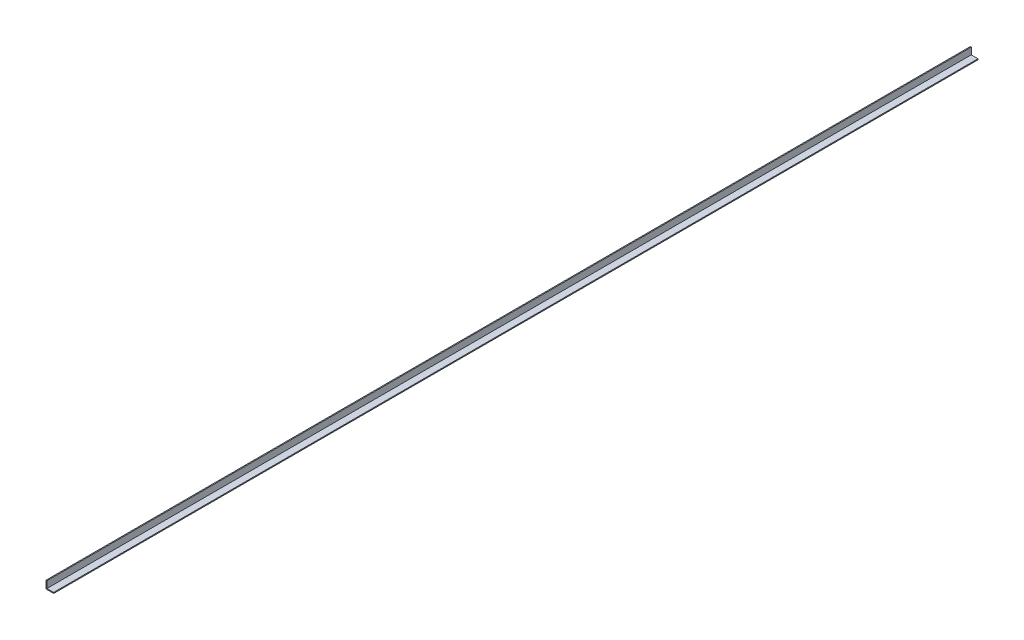
ISO-10303-21;
HEADER;
FILE_DESCRIPTION(('STEP AP214'),'2;1');
FILE_NAME('part.step','',(''),(''),'','','');
FILE_SCHEMA(('AUTOMOTIVE_DESIGN { 1 0 10303 214 1 1 1 1 }'));
ENDSEC;
DATA;
#1=APPLICATION_CONTEXT('core data for automotive mechanical design processes');
#2=APPLICATION_PROTOCOL_DEFINITION('international standard','automotive_design',2000,#1);
#3=PRODUCT_CONTEXT('',#1,'mechanical');
#4=PRODUCT('Part','Part','',(#3));
#5=PRODUCT_RELATED_PRODUCT_CATEGORY('part','',(#4));
#6=PRODUCT_DEFINITION_FORMATION('','',#4);
#7=PRODUCT_DEFINITION_CONTEXT('part definition',#1,'design');
#8=PRODUCT_DEFINITION('design','',#6,#7);
#9=PRODUCT_DEFINITION_SHAPE('','',#8);
#10=(LENGTH_UNIT() NAMED_UNIT(*) SI_UNIT(.MILLI.,.METRE.));
#11=(NAMED_UNIT(*) PLANE_ANGLE_UNIT() SI_UNIT($,.RADIAN.));
#12=(NAMED_UNIT(*) SI_UNIT($,.STERADIAN.) SOLID_ANGLE_UNIT());
#13=UNCERTAINTY_MEASURE_WITH_UNIT(LENGTH_MEASURE(1.E-05),#10,'distance_accuracy_value','');
#14=(GEOMETRIC_REPRESENTATION_CONTEXT(3) GLOBAL_UNCERTAINTY_ASSIGNED_CONTEXT((#13)) GLOBAL_UNIT_ASSIGNED_CONTEXT((#10,
#11,#12)) REPRESENTATION_CONTEXT('',''));
#15=CARTESIAN_POINT('',(0.,0.,0.));
#16=DIRECTION('',(0.,0.,1.));
#17=DIRECTION('',(1.,0.,0.));
#18=AXIS2_PLACEMENT_3D('',#15,#16,#17);
#19=CARTESIAN_POINT('',(6.35,50.8,-6100.));
#20=DIRECTION('',(0.,1.,0.));
#21=DIRECTION('',(0.,0.,1.));
#22=AXIS2_PLACEMENT_3D('',#19,#20,#21);
#23=PLANE('',#22);
#24=DIRECTION('',(-1.,0.,0.));
#25=VECTOR('',#24,1.);
#26=CARTESIAN_POINT('',(6.35,50.8,0.));
#27=LINE('',#26,#25);
#28=CARTESIAN_POINT('',(6.35,50.8,0.));
#29=VERTEX_POINT('',#28);
#30=CARTESIAN_POINT('',(0.,50.8,0.));
#31=VERTEX_POINT('',#30);
#32=EDGE_CURVE('E118',#29,#31,#27,.T.);
#33=ORIENTED_EDGE('',*,*,#32,.F.);
#34=DIRECTION('',(0.,0.,1.));
#35=VECTOR('',#34,1.);
#36=CARTESIAN_POINT('',(6.35,50.8,-6100.));
#37=LINE('',#36,#35);
#38=CARTESIAN_POINT('',(6.35,50.8,-6100.));
#39=VERTEX_POINT('',#38);
#40=EDGE_CURVE('E11',#39,#29,#37,.T.);
#41=ORIENTED_EDGE('',*,*,#40,.F.);
#42=DIRECTION('',(-1.,0.,0.));
#43=VECTOR('',#42,1.);
#44=CARTESIAN_POINT('',(6.35,50.8,-6100.));
#45=LINE('',#44,#43);
#46=CARTESIAN_POINT('',(0.,50.8,-6100.));
#47=VERTEX_POINT('',#46);
#48=EDGE_CURVE('E132',#39,#47,#45,.T.);
#49=ORIENTED_EDGE('',*,*,#48,.T.);
#50=DIRECTION('',(0.,0.,1.));
#51=VECTOR('',#50,1.);
#52=CARTESIAN_POINT('',(0.,50.8,-6100.));
#53=LINE('',#52,#51);
#54=EDGE_CURVE('E36',#47,#31,#53,.T.);
#55=ORIENTED_EDGE('',*,*,#54,.T.);
#56=EDGE_LOOP('',(#33,#41,#49,#55));
#57=FACE_BOUND('',#56,.T.);
#58=ADVANCED_FACE('F33',(#57),#23,.T.);
#59=CARTESIAN_POINT('',(6.35,6.35,-6100.));
#60=DIRECTION('',(1.,0.,0.));
#61=DIRECTION('',(0.,1.,0.));
#62=AXIS2_PLACEMENT_3D('',#59,#60,#61);
#63=PLANE('',#62);
#64=DIRECTION('',(0.,1.,0.));
#65=VECTOR('',#64,1.);
#66=CARTESIAN_POINT('',(6.35,6.35,0.));
#67=LINE('',#66,#65);
#68=CARTESIAN_POINT('',(6.35,6.35,0.));
#69=VERTEX_POINT('',#68);
#70=EDGE_CURVE('E130',#69,#29,#67,.T.);
#71=ORIENTED_EDGE('',*,*,#70,.F.);
#72=DIRECTION('',(0.,0.,1.));
#73=VECTOR('',#72,1.);
#74=CARTESIAN_POINT('',(6.35,6.35,-6100.));
#75=LINE('',#74,#73);
#76=CARTESIAN_POINT('',(6.35,6.35,-6100.));
#77=VERTEX_POINT('',#76);
#78=EDGE_CURVE('E42',#77,#69,#75,.T.);
#79=ORIENTED_EDGE('',*,*,#78,.F.);
#80=DIRECTION('',(0.,1.,0.));
#81=VECTOR('',#80,1.);
#82=CARTESIAN_POINT('',(6.35,6.35,-6100.));
#83=LINE('',#82,#81);
#84=EDGE_CURVE('E108',#77,#39,#83,.T.);
#85=ORIENTED_EDGE('',*,*,#84,.T.);
#86=ORIENTED_EDGE('',*,*,#40,.T.);
#87=EDGE_LOOP('',(#71,#79,#85,#86));
#88=FACE_BOUND('',#87,.T.);
#89=ADVANCED_FACE('F140',(#88),#63,.T.);
#90=CARTESIAN_POINT('',(50.8,6.35,-6100.));
#91=DIRECTION('',(0.,1.,0.));
#92=DIRECTION('',(-1.,0.,0.));
#93=AXIS2_PLACEMENT_3D('',#90,#91,#92);
#94=PLANE('',#93);
#95=DIRECTION('',(-1.,0.,0.));
#96=VECTOR('',#95,1.);
#97=CARTESIAN_POINT('',(50.8,6.35,0.));
#98=LINE('',#97,#96);
#99=CARTESIAN_POINT('',(50.8,6.35,0.));
#100=VERTEX_POINT('',#99);
#101=EDGE_CURVE('E95',#100,#69,#98,.T.);
#102=ORIENTED_EDGE('',*,*,#101,.F.);
#103=DIRECTION('',(0.,0.,1.));
#104=VECTOR('',#103,1.);
#105=CARTESIAN_POINT('',(50.8,6.35,-6100.));
#106=LINE('',#105,#104);
#107=CARTESIAN_POINT('',(50.8,6.35,-6100.));
#108=VERTEX_POINT('',#107);
#109=EDGE_CURVE('E90',#108,#100,#106,.T.);
#110=ORIENTED_EDGE('',*,*,#109,.F.);
#111=DIRECTION('',(-1.,0.,0.));
#112=VECTOR('',#111,1.);
#113=CARTESIAN_POINT('',(50.8,6.35,-6100.));
#114=LINE('',#113,#112);
#115=EDGE_CURVE('E93',#108,#77,#114,.T.);
#116=ORIENTED_EDGE('',*,*,#115,.T.);
#117=ORIENTED_EDGE('',*,*,#78,.T.);
#118=EDGE_LOOP('',(#102,#110,#116,#117));
#119=FACE_BOUND('',#118,.T.);
#120=ADVANCED_FACE('F92',(#119),#94,.T.);
#121=CARTESIAN_POINT('',(50.8,0.,-6100.));
#122=DIRECTION('',(1.,0.,0.));
#123=DIRECTION('',(0.,0.,-1.));
#124=AXIS2_PLACEMENT_3D('',#121,#122,#123);
#125=PLANE('',#124);
#126=DIRECTION('',(0.,1.,0.));
#127=VECTOR('',#126,1.);
#128=CARTESIAN_POINT('',(50.8,0.,0.));
#129=LINE('',#128,#127);
#130=CARTESIAN_POINT('',(50.8,0.,0.));
#131=VERTEX_POINT('',#130);
#132=EDGE_CURVE('E127',#131,#100,#129,.T.);
#133=ORIENTED_EDGE('',*,*,#132,.F.);
#134=DIRECTION('',(0.,0.,1.));
#135=VECTOR('',#134,1.);
#136=CARTESIAN_POINT('',(50.8,0.,-6100.));
#137=LINE('',#136,#135);
#138=CARTESIAN_POINT('',(50.8,0.,-6100.));
#139=VERTEX_POINT('',#138);
#140=EDGE_CURVE('E100',#139,#131,#137,.T.);
#141=ORIENTED_EDGE('',*,*,#140,.F.);
#142=DIRECTION('',(0.,1.,0.));
#143=VECTOR('',#142,1.);
#144=CARTESIAN_POINT('',(50.8,0.,-6100.));
#145=LINE('',#144,#143);
#146=EDGE_CURVE('E106',#139,#108,#145,.T.);
#147=ORIENTED_EDGE('',*,*,#146,.T.);
#148=ORIENTED_EDGE('',*,*,#109,.T.);
#149=EDGE_LOOP('',(#133,#141,#147,#148));
#150=FACE_BOUND('',#149,.T.);
#151=ADVANCED_FACE('F110',(#150),#125,.T.);
#152=CARTESIAN_POINT('',(0.,0.,-6100.));
#153=DIRECTION('',(0.,-1.,0.));
#154=DIRECTION('',(0.,0.,-1.));
#155=AXIS2_PLACEMENT_3D('',#152,#153,#154);
#156=PLANE('',#155);
#157=DIRECTION('',(1.,0.,0.));
#158=VECTOR('',#157,1.);
#159=CARTESIAN_POINT('',(0.,0.,0.));
#160=LINE('',#159,#158);
#161=CARTESIAN_POINT('',(0.,0.,0.));
#162=VERTEX_POINT('',#161);
#163=EDGE_CURVE('E124',#162,#131,#160,.T.);
#164=ORIENTED_EDGE('',*,*,#163,.F.);
#165=DIRECTION('',(0.,0.,1.));
#166=VECTOR('',#165,1.);
#167=CARTESIAN_POINT('',(0.,0.,-6100.));
#168=LINE('',#167,#166);
#169=CARTESIAN_POINT('',(0.,0.,-6100.));
#170=VERTEX_POINT('',#169);
#171=EDGE_CURVE('E135',#170,#162,#168,.T.);
#172=ORIENTED_EDGE('',*,*,#171,.F.);
#173=DIRECTION('',(1.,0.,0.));
#174=VECTOR('',#173,1.);
#175=CARTESIAN_POINT('',(0.,0.,-6100.));
#176=LINE('',#175,#174);
#177=EDGE_CURVE('E111',#170,#139,#176,.T.);
#178=ORIENTED_EDGE('',*,*,#177,.T.);
#179=ORIENTED_EDGE('',*,*,#140,.T.);
#180=EDGE_LOOP('',(#164,#172,#178,#179));
#181=FACE_BOUND('',#180,.T.);
#182=ADVANCED_FACE('F153',(#181),#156,.T.);
#183=CARTESIAN_POINT('',(0.,50.8,-6100.));
#184=DIRECTION('',(-1.,0.,0.));
#185=DIRECTION('',(0.,-1.,0.));
#186=AXIS2_PLACEMENT_3D('',#183,#184,#185);
#187=PLANE('',#186);
#188=DIRECTION('',(0.,-1.,0.));
#189=VECTOR('',#188,1.);
#190=CARTESIAN_POINT('',(0.,50.8,0.));
#191=LINE('',#190,#189);
#192=EDGE_CURVE('E121',#31,#162,#191,.T.);
#193=ORIENTED_EDGE('',*,*,#192,.F.);
#194=ORIENTED_EDGE('',*,*,#54,.F.);
#195=DIRECTION('',(0.,-1.,0.));
#196=VECTOR('',#195,1.);
#197=CARTESIAN_POINT('',(0.,50.8,-6100.));
#198=LINE('',#197,#196);
#199=EDGE_CURVE('E113',#47,#170,#198,.T.);
#200=ORIENTED_EDGE('',*,*,#199,.T.);
#201=ORIENTED_EDGE('',*,*,#171,.T.);
#202=EDGE_LOOP('',(#193,#194,#200,#201));
#203=FACE_BOUND('',#202,.T.);
#204=ADVANCED_FACE('F137',(#203),#187,.T.);
#205=CARTESIAN_POINT('',(0.,0.,-6100.));
#206=DIRECTION('',(0.,0.,1.));
#207=DIRECTION('',(1.,0.,0.));
#208=AXIS2_PLACEMENT_3D('',#205,#206,#207);
#209=PLANE('',#208);
#210=ORIENTED_EDGE('',*,*,#48,.F.);
#211=ORIENTED_EDGE('',*,*,#84,.F.);
#212=ORIENTED_EDGE('',*,*,#115,.F.);
#213=ORIENTED_EDGE('',*,*,#146,.F.);
#214=ORIENTED_EDGE('',*,*,#177,.F.);
#215=ORIENTED_EDGE('',*,*,#199,.F.);
#216=EDGE_LOOP('',(#210,#211,#212,#213,#214,#215));
#217=FACE_BOUND('',#216,.T.);
#218=ADVANCED_FACE('F104',(#217),#209,.F.);
#219=CARTESIAN_POINT('',(0.,0.,0.));
#220=DIRECTION('',(0.,0.,1.));
#221=DIRECTION('',(1.,0.,0.));
#222=AXIS2_PLACEMENT_3D('',#219,#220,#221);
#223=PLANE('',#222);
#224=ORIENTED_EDGE('',*,*,#32,.T.);
#225=ORIENTED_EDGE('',*,*,#192,.T.);
#226=ORIENTED_EDGE('',*,*,#163,.T.);
#227=ORIENTED_EDGE('',*,*,#132,.T.);
#228=ORIENTED_EDGE('',*,*,#101,.T.);
#229=ORIENTED_EDGE('',*,*,#70,.T.);
#230=EDGE_LOOP('',(#224,#225,#226,#227,#228,#229));
#231=FACE_BOUND('',#230,.T.);
#232=ADVANCED_FACE('F139',(#231),#223,.T.);
#233=CLOSED_SHELL('',(#58,#89,#120,#151,#182,#204,#218,#232));
#234=MANIFOLD_SOLID_BREP('B2',#233);
#235=ADVANCED_BREP_SHAPE_REPRESENTATION('',(#18,#234),#14);
#236=SHAPE_DEFINITION_REPRESENTATION(#9,#235);
ENDSEC;
END-ISO-10303-21;
